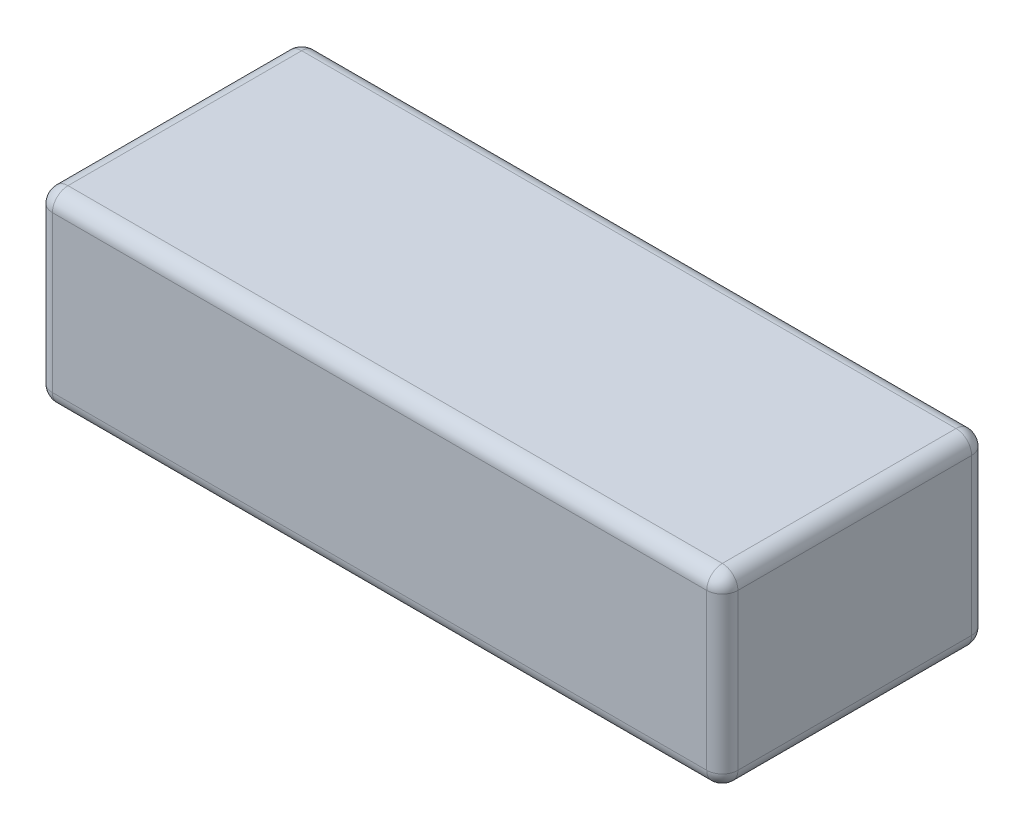
ISO-10303-21;
HEADER;
FILE_DESCRIPTION(('STEP AP214'),'2;1');
FILE_NAME('part.step','',(''),(''),'','','');
FILE_SCHEMA(('AUTOMOTIVE_DESIGN { 1 0 10303 214 1 1 1 1 }'));
ENDSEC;
DATA;
#1=APPLICATION_CONTEXT('core data for automotive mechanical design processes');
#2=APPLICATION_PROTOCOL_DEFINITION('international standard','automotive_design',2000,#1);
#3=PRODUCT_CONTEXT('',#1,'mechanical');
#4=PRODUCT('Part','Part','',(#3));
#5=PRODUCT_RELATED_PRODUCT_CATEGORY('part','',(#4));
#6=PRODUCT_DEFINITION_FORMATION('','',#4);
#7=PRODUCT_DEFINITION_CONTEXT('part definition',#1,'design');
#8=PRODUCT_DEFINITION('design','',#6,#7);
#9=PRODUCT_DEFINITION_SHAPE('','',#8);
#10=(LENGTH_UNIT() NAMED_UNIT(*) SI_UNIT(.MILLI.,.METRE.));
#11=(NAMED_UNIT(*) PLANE_ANGLE_UNIT() SI_UNIT($,.RADIAN.));
#12=(NAMED_UNIT(*) SI_UNIT($,.STERADIAN.) SOLID_ANGLE_UNIT());
#13=UNCERTAINTY_MEASURE_WITH_UNIT(LENGTH_MEASURE(1.E-05),#10,'distance_accuracy_value','');
#14=(GEOMETRIC_REPRESENTATION_CONTEXT(3) GLOBAL_UNCERTAINTY_ASSIGNED_CONTEXT((#13)) GLOBAL_UNIT_ASSIGNED_CONTEXT((#10,
#11,#12)) REPRESENTATION_CONTEXT('',''));
#15=CARTESIAN_POINT('',(0.,0.,0.));
#16=DIRECTION('',(0.,0.,1.));
#17=DIRECTION('',(1.,0.,0.));
#18=AXIS2_PLACEMENT_3D('',#15,#16,#17);
#19=CARTESIAN_POINT('',(0.,0.,0.));
#20=DIRECTION('',(0.,1.,0.));
#21=DIRECTION('',(0.,0.,1.));
#22=AXIS2_PLACEMENT_3D('',#19,#20,#21);
#23=PLANE('',#22);
#24=DIRECTION('',(0.,0.,1.));
#25=VECTOR('',#24,1.);
#26=CARTESIAN_POINT('',(-21.,0.,0.));
#27=LINE('',#26,#25);
#28=CARTESIAN_POINT('',(-21.,0.,7.5));
#29=VERTEX_POINT('',#28);
#30=CARTESIAN_POINT('',(-21.,0.,-7.5));
#31=VERTEX_POINT('',#30);
#32=EDGE_CURVE('E193',#29,#31,#27,.F.);
#33=ORIENTED_EDGE('',*,*,#32,.T.);
#34=DIRECTION('',(-1.,0.,0.));
#35=VECTOR('',#34,1.);
#36=CARTESIAN_POINT('',(0.,0.,-7.5));
#37=LINE('',#36,#35);
#38=CARTESIAN_POINT('',(21.,0.,-7.5));
#39=VERTEX_POINT('',#38);
#40=EDGE_CURVE('E195',#31,#39,#37,.F.);
#41=ORIENTED_EDGE('',*,*,#40,.T.);
#42=DIRECTION('',(0.,0.,-1.));
#43=VECTOR('',#42,1.);
#44=CARTESIAN_POINT('',(21.,0.,0.));
#45=LINE('',#44,#43);
#46=CARTESIAN_POINT('',(21.,0.,7.5));
#47=VERTEX_POINT('',#46);
#48=EDGE_CURVE('E191',#39,#47,#45,.F.);
#49=ORIENTED_EDGE('',*,*,#48,.T.);
#50=DIRECTION('',(1.,0.,0.));
#51=VECTOR('',#50,1.);
#52=CARTESIAN_POINT('',(0.,0.,7.5));
#53=LINE('',#52,#51);
#54=EDGE_CURVE('E189',#47,#29,#53,.F.);
#55=ORIENTED_EDGE('',*,*,#54,.T.);
#56=EDGE_LOOP('',(#33,#41,#49,#55));
#57=FACE_BOUND('',#56,.T.);
#58=DIRECTION('',(0.,0.,-1.));
#59=VECTOR('',#58,1.);
#60=CARTESIAN_POINT('',(-20.,0.,-6.5));
#61=LINE('',#60,#59);
#62=CARTESIAN_POINT('',(-20.,0.,6.5));
#63=VERTEX_POINT('',#62);
#64=CARTESIAN_POINT('',(-20.,0.,-6.5));
#65=VERTEX_POINT('',#64);
#66=EDGE_CURVE('E171',#63,#65,#61,.T.);
#67=ORIENTED_EDGE('',*,*,#66,.F.);
#68=DIRECTION('',(-1.,0.,0.));
#69=VECTOR('',#68,1.);
#70=CARTESIAN_POINT('',(20.,0.,6.5));
#71=LINE('',#70,#69);
#72=CARTESIAN_POINT('',(20.,0.,6.5));
#73=VERTEX_POINT('',#72);
#74=EDGE_CURVE('E168',#73,#63,#71,.T.);
#75=ORIENTED_EDGE('',*,*,#74,.F.);
#76=DIRECTION('',(0.,0.,1.));
#77=VECTOR('',#76,1.);
#78=CARTESIAN_POINT('',(20.,0.,-6.5));
#79=LINE('',#78,#77);
#80=CARTESIAN_POINT('',(20.,0.,-6.5));
#81=VERTEX_POINT('',#80);
#82=EDGE_CURVE('E58',#81,#73,#79,.T.);
#83=ORIENTED_EDGE('',*,*,#82,.F.);
#84=DIRECTION('',(1.,0.,0.));
#85=VECTOR('',#84,1.);
#86=CARTESIAN_POINT('',(20.,0.,-6.5));
#87=LINE('',#86,#85);
#88=EDGE_CURVE('E53',#65,#81,#87,.T.);
#89=ORIENTED_EDGE('',*,*,#88,.F.);
#90=EDGE_LOOP('',(#67,#75,#83,#89));
#91=FACE_BOUND('',#90,.T.);
#92=ADVANCED_FACE('F36',(#57,#91),#23,.F.);
#93=CARTESIAN_POINT('',(22.,12.,-8.5));
#94=DIRECTION('',(-1.,0.,0.));
#95=DIRECTION('',(0.,0.,1.));
#96=AXIS2_PLACEMENT_3D('',#93,#94,#95);
#97=PLANE('',#96);
#98=DIRECTION('',(0.,0.,-1.));
#99=VECTOR('',#98,1.);
#100=CARTESIAN_POINT('',(22.,11.,8.5));
#101=LINE('',#100,#99);
#102=CARTESIAN_POINT('',(22.,11.,-7.5));
#103=VERTEX_POINT('',#102);
#104=CARTESIAN_POINT('',(22.,11.,7.5));
#105=VERTEX_POINT('',#104);
#106=EDGE_CURVE('E209',#103,#105,#101,.F.);
#107=ORIENTED_EDGE('',*,*,#106,.T.);
#108=DIRECTION('',(0.,-1.,0.));
#109=VECTOR('',#108,1.);
#110=CARTESIAN_POINT('',(22.,12.,7.5));
#111=LINE('',#110,#109);
#112=CARTESIAN_POINT('',(22.,1.,7.5));
#113=VERTEX_POINT('',#112);
#114=EDGE_CURVE('E214',#105,#113,#111,.T.);
#115=ORIENTED_EDGE('',*,*,#114,.T.);
#116=DIRECTION('',(0.,0.,-1.));
#117=VECTOR('',#116,1.);
#118=CARTESIAN_POINT('',(22.,1.,-8.5));
#119=LINE('',#118,#117);
#120=CARTESIAN_POINT('',(22.,1.,-7.5));
#121=VERTEX_POINT('',#120);
#122=EDGE_CURVE('E211',#113,#121,#119,.T.);
#123=ORIENTED_EDGE('',*,*,#122,.T.);
#124=DIRECTION('',(0.,-1.,0.));
#125=VECTOR('',#124,1.);
#126=CARTESIAN_POINT('',(22.,12.,-7.5));
#127=LINE('',#126,#125);
#128=EDGE_CURVE('E207',#121,#103,#127,.F.);
#129=ORIENTED_EDGE('',*,*,#128,.T.);
#130=EDGE_LOOP('',(#107,#115,#123,#129));
#131=FACE_BOUND('',#130,.T.);
#132=ADVANCED_FACE('F309',(#131),#97,.F.);
#133=CARTESIAN_POINT('',(-22.,12.,-8.5));
#134=DIRECTION('',(0.,0.,1.));
#135=DIRECTION('',(1.,0.,0.));
#136=AXIS2_PLACEMENT_3D('',#133,#134,#135);
#137=PLANE('',#136);
#138=DIRECTION('',(0.,-1.,0.));
#139=VECTOR('',#138,1.);
#140=CARTESIAN_POINT('',(21.,12.,-8.5));
#141=LINE('',#140,#139);
#142=CARTESIAN_POINT('',(21.,11.,-8.5));
#143=VERTEX_POINT('',#142);
#144=CARTESIAN_POINT('',(21.,1.,-8.5));
#145=VERTEX_POINT('',#144);
#146=EDGE_CURVE('E180',#143,#145,#141,.T.);
#147=ORIENTED_EDGE('',*,*,#146,.T.);
#148=DIRECTION('',(-1.,0.,0.));
#149=VECTOR('',#148,1.);
#150=CARTESIAN_POINT('',(-22.,1.,-8.5));
#151=LINE('',#150,#149);
#152=CARTESIAN_POINT('',(-21.,1.,-8.5));
#153=VERTEX_POINT('',#152);
#154=EDGE_CURVE('E186',#145,#153,#151,.T.);
#155=ORIENTED_EDGE('',*,*,#154,.T.);
#156=DIRECTION('',(0.,-1.,0.));
#157=VECTOR('',#156,1.);
#158=CARTESIAN_POINT('',(-21.,12.,-8.5));
#159=LINE('',#158,#157);
#160=CARTESIAN_POINT('',(-21.,11.,-8.5));
#161=VERTEX_POINT('',#160);
#162=EDGE_CURVE('E184',#153,#161,#159,.F.);
#163=ORIENTED_EDGE('',*,*,#162,.T.);
#164=DIRECTION('',(-1.,0.,0.));
#165=VECTOR('',#164,1.);
#166=CARTESIAN_POINT('',(22.,11.,-8.5));
#167=LINE('',#166,#165);
#168=EDGE_CURVE('E182',#161,#143,#167,.F.);
#169=ORIENTED_EDGE('',*,*,#168,.T.);
#170=EDGE_LOOP('',(#147,#155,#163,#169));
#171=FACE_BOUND('',#170,.T.);
#172=ADVANCED_FACE('F385',(#171),#137,.F.);
#173=CARTESIAN_POINT('',(-22.,12.,-8.5));
#174=DIRECTION('',(1.,0.,0.));
#175=DIRECTION('',(0.,0.,-1.));
#176=AXIS2_PLACEMENT_3D('',#173,#174,#175);
#177=PLANE('',#176);
#178=DIRECTION('',(0.,0.,1.));
#179=VECTOR('',#178,1.);
#180=CARTESIAN_POINT('',(-22.,11.,-8.5));
#181=LINE('',#180,#179);
#182=CARTESIAN_POINT('',(-22.,11.,7.5));
#183=VERTEX_POINT('',#182);
#184=CARTESIAN_POINT('',(-22.,11.,-7.5));
#185=VERTEX_POINT('',#184);
#186=EDGE_CURVE('E200',#183,#185,#181,.F.);
#187=ORIENTED_EDGE('',*,*,#186,.T.);
#188=DIRECTION('',(0.,-1.,0.));
#189=VECTOR('',#188,1.);
#190=CARTESIAN_POINT('',(-22.,12.,-7.5));
#191=LINE('',#190,#189);
#192=CARTESIAN_POINT('',(-22.,1.,-7.5));
#193=VERTEX_POINT('',#192);
#194=EDGE_CURVE('E204',#185,#193,#191,.T.);
#195=ORIENTED_EDGE('',*,*,#194,.T.);
#196=DIRECTION('',(0.,0.,1.));
#197=VECTOR('',#196,1.);
#198=CARTESIAN_POINT('',(-22.,1.,-8.5));
#199=LINE('',#198,#197);
#200=CARTESIAN_POINT('',(-22.,1.,7.5));
#201=VERTEX_POINT('',#200);
#202=EDGE_CURVE('E202',#193,#201,#199,.T.);
#203=ORIENTED_EDGE('',*,*,#202,.T.);
#204=DIRECTION('',(0.,-1.,0.));
#205=VECTOR('',#204,1.);
#206=CARTESIAN_POINT('',(-22.,12.,7.5));
#207=LINE('',#206,#205);
#208=EDGE_CURVE('E198',#201,#183,#207,.F.);
#209=ORIENTED_EDGE('',*,*,#208,.T.);
#210=EDGE_LOOP('',(#187,#195,#203,#209));
#211=FACE_BOUND('',#210,.T.);
#212=ADVANCED_FACE('F364',(#211),#177,.F.);
#213=CARTESIAN_POINT('',(-22.,12.,8.5));
#214=DIRECTION('',(0.,0.,-1.));
#215=DIRECTION('',(-1.,0.,0.));
#216=AXIS2_PLACEMENT_3D('',#213,#214,#215);
#217=PLANE('',#216);
#218=DIRECTION('',(1.,0.,0.));
#219=VECTOR('',#218,1.);
#220=CARTESIAN_POINT('',(-22.,1.,8.5));
#221=LINE('',#220,#219);
#222=CARTESIAN_POINT('',(-21.,1.,8.5));
#223=VERTEX_POINT('',#222);
#224=CARTESIAN_POINT('',(21.,1.,8.5));
#225=VERTEX_POINT('',#224);
#226=EDGE_CURVE('E220',#223,#225,#221,.T.);
#227=ORIENTED_EDGE('',*,*,#226,.T.);
#228=DIRECTION('',(0.,-1.,0.));
#229=VECTOR('',#228,1.);
#230=CARTESIAN_POINT('',(21.,12.,8.5));
#231=LINE('',#230,#229);
#232=CARTESIAN_POINT('',(21.,11.,8.5));
#233=VERTEX_POINT('',#232);
#234=EDGE_CURVE('E223',#225,#233,#231,.F.);
#235=ORIENTED_EDGE('',*,*,#234,.T.);
#236=DIRECTION('',(1.,0.,0.));
#237=VECTOR('',#236,1.);
#238=CARTESIAN_POINT('',(-22.,11.,8.5));
#239=LINE('',#238,#237);
#240=CARTESIAN_POINT('',(-21.,11.,8.5));
#241=VERTEX_POINT('',#240);
#242=EDGE_CURVE('E218',#233,#241,#239,.F.);
#243=ORIENTED_EDGE('',*,*,#242,.T.);
#244=DIRECTION('',(0.,-1.,0.));
#245=VECTOR('',#244,1.);
#246=CARTESIAN_POINT('',(-21.,12.,8.5));
#247=LINE('',#246,#245);
#248=EDGE_CURVE('E216',#241,#223,#247,.T.);
#249=ORIENTED_EDGE('',*,*,#248,.T.);
#250=EDGE_LOOP('',(#227,#235,#243,#249));
#251=FACE_BOUND('',#250,.T.);
#252=ADVANCED_FACE('F329',(#251),#217,.F.);
#253=CARTESIAN_POINT('',(0.,12.,0.));
#254=DIRECTION('',(0.,1.,0.));
#255=DIRECTION('',(0.,0.,1.));
#256=AXIS2_PLACEMENT_3D('',#253,#254,#255);
#257=PLANE('',#256);
#258=DIRECTION('',(1.,0.,0.));
#259=VECTOR('',#258,1.);
#260=CARTESIAN_POINT('',(22.,12.,7.5));
#261=LINE('',#260,#259);
#262=CARTESIAN_POINT('',(-21.,12.,7.5));
#263=VERTEX_POINT('',#262);
#264=CARTESIAN_POINT('',(21.,12.,7.5));
#265=VERTEX_POINT('',#264);
#266=EDGE_CURVE('E225',#263,#265,#261,.T.);
#267=ORIENTED_EDGE('',*,*,#266,.T.);
#268=DIRECTION('',(0.,0.,-1.));
#269=VECTOR('',#268,1.);
#270=CARTESIAN_POINT('',(21.,12.,-8.5));
#271=LINE('',#270,#269);
#272=CARTESIAN_POINT('',(21.,12.,-7.5));
#273=VERTEX_POINT('',#272);
#274=EDGE_CURVE('E12',#265,#273,#271,.T.);
#275=ORIENTED_EDGE('',*,*,#274,.T.);
#276=DIRECTION('',(-1.,0.,0.));
#277=VECTOR('',#276,1.);
#278=CARTESIAN_POINT('',(-22.,12.,-7.5));
#279=LINE('',#278,#277);
#280=CARTESIAN_POINT('',(-21.,12.,-7.5));
#281=VERTEX_POINT('',#280);
#282=EDGE_CURVE('E45',#273,#281,#279,.T.);
#283=ORIENTED_EDGE('',*,*,#282,.T.);
#284=DIRECTION('',(0.,0.,1.));
#285=VECTOR('',#284,1.);
#286=CARTESIAN_POINT('',(-21.,12.,8.5));
#287=LINE('',#286,#285);
#288=EDGE_CURVE('E227',#281,#263,#287,.T.);
#289=ORIENTED_EDGE('',*,*,#288,.T.);
#290=EDGE_LOOP('',(#267,#275,#283,#289));
#291=FACE_BOUND('',#290,.T.);
#292=ADVANCED_FACE('F318',(#291),#257,.T.);
#293=CARTESIAN_POINT('',(0.,11.,7.5));
#294=DIRECTION('',(-1.,0.,0.));
#295=DIRECTION('',(0.,0.,1.));
#296=AXIS2_PLACEMENT_3D('',#293,#294,#295);
#297=CYLINDRICAL_SURFACE('',#296,1.);
#298=CARTESIAN_POINT('',(21.,11.,7.5));
#299=DIRECTION('',(1.,0.,0.));
#300=DIRECTION('',(0.,0.,-1.));
#301=AXIS2_PLACEMENT_3D('',#298,#299,#300);
#302=CIRCLE('',#301,1.);
#303=EDGE_CURVE('E40',#265,#233,#302,.T.);
#304=ORIENTED_EDGE('',*,*,#303,.F.);
#305=ORIENTED_EDGE('',*,*,#266,.F.);
#306=CARTESIAN_POINT('',(-21.,11.,7.5));
#307=DIRECTION('',(-1.,0.,0.));
#308=DIRECTION('',(0.,0.,1.));
#309=AXIS2_PLACEMENT_3D('',#306,#307,#308);
#310=CIRCLE('',#309,1.);
#311=EDGE_CURVE('E286',#241,#263,#310,.T.);
#312=ORIENTED_EDGE('',*,*,#311,.F.);
#313=ORIENTED_EDGE('',*,*,#242,.F.);
#314=EDGE_LOOP('',(#304,#305,#312,#313));
#315=FACE_BOUND('',#314,.T.);
#316=ADVANCED_FACE('F38',(#315),#297,.T.);
#317=CARTESIAN_POINT('',(21.,11.,7.5));
#318=DIRECTION('',(0.,0.,1.));
#319=DIRECTION('',(1.,0.,0.));
#320=AXIS2_PLACEMENT_3D('',#317,#318,#319);
#321=SPHERICAL_SURFACE('',#320,1.);
#322=CARTESIAN_POINT('',(21.,11.,7.5));
#323=DIRECTION('',(0.,0.,1.));
#324=DIRECTION('',(0.,-1.,0.));
#325=AXIS2_PLACEMENT_3D('',#322,#323,#324);
#326=CIRCLE('',#325,1.);
#327=EDGE_CURVE('E281',#265,#105,#326,.F.);
#328=ORIENTED_EDGE('',*,*,#327,.F.);
#329=ORIENTED_EDGE('',*,*,#303,.T.);
#330=CARTESIAN_POINT('',(21.,11.,7.5));
#331=DIRECTION('',(0.,1.,0.));
#332=DIRECTION('',(0.,0.,1.));
#333=AXIS2_PLACEMENT_3D('',#330,#331,#332);
#334=CIRCLE('',#333,1.);
#335=EDGE_CURVE('E284',#105,#233,#334,.F.);
#336=ORIENTED_EDGE('',*,*,#335,.F.);
#337=EDGE_LOOP('',(#328,#329,#336));
#338=FACE_BOUND('',#337,.T.);
#339=ADVANCED_FACE('F297',(#338),#321,.T.);
#340=CARTESIAN_POINT('',(-21.,11.,7.5));
#341=DIRECTION('',(0.,0.,1.));
#342=DIRECTION('',(1.,0.,0.));
#343=AXIS2_PLACEMENT_3D('',#340,#341,#342);
#344=SPHERICAL_SURFACE('',#343,1.);
#345=CARTESIAN_POINT('',(-21.,11.,7.5));
#346=DIRECTION('',(0.,1.,0.));
#347=DIRECTION('',(0.,0.,1.));
#348=AXIS2_PLACEMENT_3D('',#345,#346,#347);
#349=CIRCLE('',#348,1.);
#350=EDGE_CURVE('E275',#241,#183,#349,.F.);
#351=ORIENTED_EDGE('',*,*,#350,.F.);
#352=ORIENTED_EDGE('',*,*,#311,.T.);
#353=CARTESIAN_POINT('',(-21.,11.,7.5));
#354=DIRECTION('',(0.,0.,1.));
#355=DIRECTION('',(1.,0.,0.));
#356=AXIS2_PLACEMENT_3D('',#353,#354,#355);
#357=CIRCLE('',#356,1.);
#358=EDGE_CURVE('E278',#183,#263,#357,.F.);
#359=ORIENTED_EDGE('',*,*,#358,.F.);
#360=EDGE_LOOP('',(#351,#352,#359));
#361=FACE_BOUND('',#360,.T.);
#362=ADVANCED_FACE('F321',(#361),#344,.T.);
#363=CARTESIAN_POINT('',(21.,12.,7.5));
#364=DIRECTION('',(0.,-1.,0.));
#365=DIRECTION('',(0.,0.,-1.));
#366=AXIS2_PLACEMENT_3D('',#363,#364,#365);
#367=CYLINDRICAL_SURFACE('',#366,1.);
#368=ORIENTED_EDGE('',*,*,#335,.T.);
#369=ORIENTED_EDGE('',*,*,#234,.F.);
#370=CARTESIAN_POINT('',(21.,1.,7.5));
#371=DIRECTION('',(0.,-1.,0.));
#372=DIRECTION('',(0.,0.,-1.));
#373=AXIS2_PLACEMENT_3D('',#370,#371,#372);
#374=CIRCLE('',#373,1.);
#375=EDGE_CURVE('E270',#113,#225,#374,.T.);
#376=ORIENTED_EDGE('',*,*,#375,.F.);
#377=ORIENTED_EDGE('',*,*,#114,.F.);
#378=EDGE_LOOP('',(#368,#369,#376,#377));
#379=FACE_BOUND('',#378,.T.);
#380=ADVANCED_FACE('F305',(#379),#367,.T.);
#381=CARTESIAN_POINT('',(21.,11.,0.));
#382=DIRECTION('',(0.,0.,1.));
#383=DIRECTION('',(1.,0.,0.));
#384=AXIS2_PLACEMENT_3D('',#381,#382,#383);
#385=CYLINDRICAL_SURFACE('',#384,1.);
#386=ORIENTED_EDGE('',*,*,#327,.T.);
#387=ORIENTED_EDGE('',*,*,#106,.F.);
#388=CARTESIAN_POINT('',(21.,11.,-7.5));
#389=DIRECTION('',(0.,0.,-1.));
#390=DIRECTION('',(-1.,0.,0.));
#391=AXIS2_PLACEMENT_3D('',#388,#389,#390);
#392=CIRCLE('',#391,1.);
#393=EDGE_CURVE('E267',#273,#103,#392,.T.);
#394=ORIENTED_EDGE('',*,*,#393,.F.);
#395=ORIENTED_EDGE('',*,*,#274,.F.);
#396=EDGE_LOOP('',(#386,#387,#394,#395));
#397=FACE_BOUND('',#396,.T.);
#398=ADVANCED_FACE('F315',(#397),#385,.T.);
#399=CARTESIAN_POINT('',(0.,11.,-7.5));
#400=DIRECTION('',(1.,0.,0.));
#401=DIRECTION('',(0.,0.,-1.));
#402=AXIS2_PLACEMENT_3D('',#399,#400,#401);
#403=CYLINDRICAL_SURFACE('',#402,1.);
#404=CARTESIAN_POINT('',(-21.,11.,-7.5));
#405=DIRECTION('',(-1.,0.,0.));
#406=DIRECTION('',(0.,0.,1.));
#407=AXIS2_PLACEMENT_3D('',#404,#405,#406);
#408=CIRCLE('',#407,1.);
#409=EDGE_CURVE('E262',#281,#161,#408,.T.);
#410=ORIENTED_EDGE('',*,*,#409,.F.);
#411=ORIENTED_EDGE('',*,*,#282,.F.);
#412=CARTESIAN_POINT('',(21.,11.,-7.5));
#413=DIRECTION('',(1.,0.,0.));
#414=DIRECTION('',(0.,0.,-1.));
#415=AXIS2_PLACEMENT_3D('',#412,#413,#414);
#416=CIRCLE('',#415,1.);
#417=EDGE_CURVE('E265',#143,#273,#416,.T.);
#418=ORIENTED_EDGE('',*,*,#417,.F.);
#419=ORIENTED_EDGE('',*,*,#168,.F.);
#420=EDGE_LOOP('',(#410,#411,#418,#419));
#421=FACE_BOUND('',#420,.T.);
#422=ADVANCED_FACE('F355',(#421),#403,.T.);
#423=CARTESIAN_POINT('',(-21.,11.,0.));
#424=DIRECTION('',(0.,0.,-1.));
#425=DIRECTION('',(-1.,0.,0.));
#426=AXIS2_PLACEMENT_3D('',#423,#424,#425);
#427=CYLINDRICAL_SURFACE('',#426,1.);
#428=ORIENTED_EDGE('',*,*,#358,.T.);
#429=ORIENTED_EDGE('',*,*,#288,.F.);
#430=CARTESIAN_POINT('',(-21.,11.,-7.5));
#431=DIRECTION('',(0.,0.,-1.));
#432=DIRECTION('',(-1.,0.,0.));
#433=AXIS2_PLACEMENT_3D('',#430,#431,#432);
#434=CIRCLE('',#433,1.);
#435=EDGE_CURVE('E259',#185,#281,#434,.T.);
#436=ORIENTED_EDGE('',*,*,#435,.F.);
#437=ORIENTED_EDGE('',*,*,#186,.F.);
#438=EDGE_LOOP('',(#428,#429,#436,#437));
#439=FACE_BOUND('',#438,.T.);
#440=ADVANCED_FACE('F362',(#439),#427,.T.);
#441=CARTESIAN_POINT('',(-21.,12.,7.5));
#442=DIRECTION('',(0.,-1.,0.));
#443=DIRECTION('',(0.,0.,-1.));
#444=AXIS2_PLACEMENT_3D('',#441,#442,#443);
#445=CYLINDRICAL_SURFACE('',#444,1.);
#446=ORIENTED_EDGE('',*,*,#350,.T.);
#447=ORIENTED_EDGE('',*,*,#208,.F.);
#448=CARTESIAN_POINT('',(-21.,1.,7.5));
#449=DIRECTION('',(0.,-1.,0.));
#450=DIRECTION('',(0.,0.,-1.));
#451=AXIS2_PLACEMENT_3D('',#448,#449,#450);
#452=CIRCLE('',#451,1.);
#453=EDGE_CURVE('E256',#223,#201,#452,.T.);
#454=ORIENTED_EDGE('',*,*,#453,.F.);
#455=ORIENTED_EDGE('',*,*,#248,.F.);
#456=EDGE_LOOP('',(#446,#447,#454,#455));
#457=FACE_BOUND('',#456,.T.);
#458=ADVANCED_FACE('F326',(#457),#445,.T.);
#459=CARTESIAN_POINT('',(-22.,1.,7.5));
#460=DIRECTION('',(1.,0.,0.));
#461=DIRECTION('',(0.,0.,-1.));
#462=AXIS2_PLACEMENT_3D('',#459,#460,#461);
#463=CYLINDRICAL_SURFACE('',#462,1.);
#464=CARTESIAN_POINT('',(21.,1.,7.5));
#465=DIRECTION('',(1.,0.,0.));
#466=DIRECTION('',(0.,0.,-1.));
#467=AXIS2_PLACEMENT_3D('',#464,#465,#466);
#468=CIRCLE('',#467,1.);
#469=EDGE_CURVE('E272',#225,#47,#468,.T.);
#470=ORIENTED_EDGE('',*,*,#469,.F.);
#471=ORIENTED_EDGE('',*,*,#226,.F.);
#472=CARTESIAN_POINT('',(-21.,1.,7.5));
#473=DIRECTION('',(-1.,0.,0.));
#474=DIRECTION('',(0.,0.,1.));
#475=AXIS2_PLACEMENT_3D('',#472,#473,#474);
#476=CIRCLE('',#475,1.);
#477=EDGE_CURVE('E253',#29,#223,#476,.T.);
#478=ORIENTED_EDGE('',*,*,#477,.F.);
#479=ORIENTED_EDGE('',*,*,#54,.F.);
#480=EDGE_LOOP('',(#470,#471,#478,#479));
#481=FACE_BOUND('',#480,.T.);
#482=ADVANCED_FACE('F333',(#481),#463,.T.);
#483=CARTESIAN_POINT('',(21.,1.,7.5));
#484=DIRECTION('',(0.,0.,1.));
#485=DIRECTION('',(1.,0.,0.));
#486=AXIS2_PLACEMENT_3D('',#483,#484,#485);
#487=SPHERICAL_SURFACE('',#486,1.);
#488=ORIENTED_EDGE('',*,*,#375,.T.);
#489=ORIENTED_EDGE('',*,*,#469,.T.);
#490=CARTESIAN_POINT('',(21.,1.,7.5));
#491=DIRECTION('',(0.,0.,1.));
#492=DIRECTION('',(1.,0.,0.));
#493=AXIS2_PLACEMENT_3D('',#490,#491,#492);
#494=CIRCLE('',#493,1.);
#495=EDGE_CURVE('E250',#113,#47,#494,.F.);
#496=ORIENTED_EDGE('',*,*,#495,.F.);
#497=EDGE_LOOP('',(#488,#489,#496));
#498=FACE_BOUND('',#497,.T.);
#499=ADVANCED_FACE('F337',(#498),#487,.T.);
#500=CARTESIAN_POINT('',(21.,11.,-7.5));
#501=DIRECTION('',(0.,0.,1.));
#502=DIRECTION('',(1.,0.,0.));
#503=AXIS2_PLACEMENT_3D('',#500,#501,#502);
#504=SPHERICAL_SURFACE('',#503,1.);
#505=ORIENTED_EDGE('',*,*,#417,.T.);
#506=ORIENTED_EDGE('',*,*,#393,.T.);
#507=CARTESIAN_POINT('',(21.,11.,-7.5));
#508=DIRECTION('',(0.,1.,0.));
#509=DIRECTION('',(0.,0.,1.));
#510=AXIS2_PLACEMENT_3D('',#507,#508,#509);
#511=CIRCLE('',#510,1.);
#512=EDGE_CURVE('E247',#143,#103,#511,.F.);
#513=ORIENTED_EDGE('',*,*,#512,.F.);
#514=EDGE_LOOP('',(#505,#506,#513));
#515=FACE_BOUND('',#514,.T.);
#516=ADVANCED_FACE('F350',(#515),#504,.T.);
#517=CARTESIAN_POINT('',(-21.,11.,-7.5));
#518=DIRECTION('',(0.,0.,1.));
#519=DIRECTION('',(1.,0.,0.));
#520=AXIS2_PLACEMENT_3D('',#517,#518,#519);
#521=SPHERICAL_SURFACE('',#520,1.);
#522=ORIENTED_EDGE('',*,*,#435,.T.);
#523=ORIENTED_EDGE('',*,*,#409,.T.);
#524=CARTESIAN_POINT('',(-21.,11.,-7.5));
#525=DIRECTION('',(0.,1.,0.));
#526=DIRECTION('',(0.,0.,1.));
#527=AXIS2_PLACEMENT_3D('',#524,#525,#526);
#528=CIRCLE('',#527,1.);
#529=EDGE_CURVE('E244',#185,#161,#528,.F.);
#530=ORIENTED_EDGE('',*,*,#529,.F.);
#531=EDGE_LOOP('',(#522,#523,#530));
#532=FACE_BOUND('',#531,.T.);
#533=ADVANCED_FACE('F359',(#532),#521,.T.);
#534=CARTESIAN_POINT('',(-21.,1.,7.5));
#535=DIRECTION('',(0.,0.,1.));
#536=DIRECTION('',(1.,0.,0.));
#537=AXIS2_PLACEMENT_3D('',#534,#535,#536);
#538=SPHERICAL_SURFACE('',#537,1.);
#539=ORIENTED_EDGE('',*,*,#477,.T.);
#540=ORIENTED_EDGE('',*,*,#453,.T.);
#541=CARTESIAN_POINT('',(-21.,1.,7.5));
#542=DIRECTION('',(0.,0.,1.));
#543=DIRECTION('',(1.,0.,0.));
#544=AXIS2_PLACEMENT_3D('',#541,#542,#543);
#545=CIRCLE('',#544,1.);
#546=EDGE_CURVE('E241',#29,#201,#545,.F.);
#547=ORIENTED_EDGE('',*,*,#546,.F.);
#548=EDGE_LOOP('',(#539,#540,#547));
#549=FACE_BOUND('',#548,.T.);
#550=ADVANCED_FACE('F367',(#549),#538,.T.);
#551=CARTESIAN_POINT('',(21.,1.,-8.5));
#552=DIRECTION('',(0.,0.,-1.));
#553=DIRECTION('',(-1.,0.,0.));
#554=AXIS2_PLACEMENT_3D('',#551,#552,#553);
#555=CYLINDRICAL_SURFACE('',#554,1.);
#556=ORIENTED_EDGE('',*,*,#495,.T.);
#557=ORIENTED_EDGE('',*,*,#48,.F.);
#558=CARTESIAN_POINT('',(21.,1.,-7.5));
#559=DIRECTION('',(0.,0.,-1.));
#560=DIRECTION('',(-1.,0.,0.));
#561=AXIS2_PLACEMENT_3D('',#558,#559,#560);
#562=CIRCLE('',#561,1.);
#563=EDGE_CURVE('E238',#121,#39,#562,.T.);
#564=ORIENTED_EDGE('',*,*,#563,.F.);
#565=ORIENTED_EDGE('',*,*,#122,.F.);
#566=EDGE_LOOP('',(#556,#557,#564,#565));
#567=FACE_BOUND('',#566,.T.);
#568=ADVANCED_FACE('F340',(#567),#555,.T.);
#569=CARTESIAN_POINT('',(21.,12.,-7.5));
#570=DIRECTION('',(0.,-1.,0.));
#571=DIRECTION('',(0.,0.,-1.));
#572=AXIS2_PLACEMENT_3D('',#569,#570,#571);
#573=CYLINDRICAL_SURFACE('',#572,1.);
#574=ORIENTED_EDGE('',*,*,#512,.T.);
#575=ORIENTED_EDGE('',*,*,#128,.F.);
#576=CARTESIAN_POINT('',(21.,1.,-7.5));
#577=DIRECTION('',(0.,-1.,0.));
#578=DIRECTION('',(0.,0.,-1.));
#579=AXIS2_PLACEMENT_3D('',#576,#577,#578);
#580=CIRCLE('',#579,1.);
#581=EDGE_CURVE('E236',#145,#121,#580,.T.);
#582=ORIENTED_EDGE('',*,*,#581,.F.);
#583=ORIENTED_EDGE('',*,*,#146,.F.);
#584=EDGE_LOOP('',(#574,#575,#582,#583));
#585=FACE_BOUND('',#584,.T.);
#586=ADVANCED_FACE('F346',(#585),#573,.T.);
#587=CARTESIAN_POINT('',(-21.,12.,-7.5));
#588=DIRECTION('',(0.,-1.,0.));
#589=DIRECTION('',(0.,0.,-1.));
#590=AXIS2_PLACEMENT_3D('',#587,#588,#589);
#591=CYLINDRICAL_SURFACE('',#590,1.);
#592=ORIENTED_EDGE('',*,*,#529,.T.);
#593=ORIENTED_EDGE('',*,*,#162,.F.);
#594=CARTESIAN_POINT('',(-21.,1.,-7.5));
#595=DIRECTION('',(0.,-1.,0.));
#596=DIRECTION('',(0.,0.,-1.));
#597=AXIS2_PLACEMENT_3D('',#594,#595,#596);
#598=CIRCLE('',#597,1.);
#599=EDGE_CURVE('E233',#193,#153,#598,.T.);
#600=ORIENTED_EDGE('',*,*,#599,.F.);
#601=ORIENTED_EDGE('',*,*,#194,.F.);
#602=EDGE_LOOP('',(#592,#593,#600,#601));
#603=FACE_BOUND('',#602,.T.);
#604=ADVANCED_FACE('F383',(#603),#591,.T.);
#605=CARTESIAN_POINT('',(-21.,1.,-8.5));
#606=DIRECTION('',(0.,0.,1.));
#607=DIRECTION('',(1.,0.,0.));
#608=AXIS2_PLACEMENT_3D('',#605,#606,#607);
#609=CYLINDRICAL_SURFACE('',#608,1.);
#610=ORIENTED_EDGE('',*,*,#546,.T.);
#611=ORIENTED_EDGE('',*,*,#202,.F.);
#612=CARTESIAN_POINT('',(-21.,1.,-7.5));
#613=DIRECTION('',(0.,0.,-1.));
#614=DIRECTION('',(-1.,0.,0.));
#615=AXIS2_PLACEMENT_3D('',#612,#613,#614);
#616=CIRCLE('',#615,1.);
#617=EDGE_CURVE('E231',#31,#193,#616,.T.);
#618=ORIENTED_EDGE('',*,*,#617,.F.);
#619=ORIENTED_EDGE('',*,*,#32,.F.);
#620=EDGE_LOOP('',(#610,#611,#618,#619));
#621=FACE_BOUND('',#620,.T.);
#622=ADVANCED_FACE('F370',(#621),#609,.T.);
#623=CARTESIAN_POINT('',(21.,1.,-7.5));
#624=DIRECTION('',(0.,0.,1.));
#625=DIRECTION('',(1.,0.,0.));
#626=AXIS2_PLACEMENT_3D('',#623,#624,#625);
#627=SPHERICAL_SURFACE('',#626,1.);
#628=ORIENTED_EDGE('',*,*,#581,.T.);
#629=ORIENTED_EDGE('',*,*,#563,.T.);
#630=CARTESIAN_POINT('',(21.,1.,-7.5));
#631=DIRECTION('',(1.,0.,0.));
#632=DIRECTION('',(0.,0.,-1.));
#633=AXIS2_PLACEMENT_3D('',#630,#631,#632);
#634=CIRCLE('',#633,1.);
#635=EDGE_CURVE('E174',#145,#39,#634,.F.);
#636=ORIENTED_EDGE('',*,*,#635,.F.);
#637=EDGE_LOOP('',(#628,#629,#636));
#638=FACE_BOUND('',#637,.T.);
#639=ADVANCED_FACE('F444',(#638),#627,.T.);
#640=CARTESIAN_POINT('',(-21.,1.,-7.5));
#641=DIRECTION('',(0.,0.,1.));
#642=DIRECTION('',(1.,0.,0.));
#643=AXIS2_PLACEMENT_3D('',#640,#641,#642);
#644=SPHERICAL_SURFACE('',#643,1.);
#645=ORIENTED_EDGE('',*,*,#617,.T.);
#646=ORIENTED_EDGE('',*,*,#599,.T.);
#647=CARTESIAN_POINT('',(-21.,1.,-7.5));
#648=DIRECTION('',(-1.,0.,0.));
#649=DIRECTION('',(0.,0.,1.));
#650=AXIS2_PLACEMENT_3D('',#647,#648,#649);
#651=CIRCLE('',#650,1.);
#652=EDGE_CURVE('E172',#31,#153,#651,.F.);
#653=ORIENTED_EDGE('',*,*,#652,.F.);
#654=EDGE_LOOP('',(#645,#646,#653));
#655=FACE_BOUND('',#654,.T.);
#656=ADVANCED_FACE('F379',(#655),#644,.T.);
#657=CARTESIAN_POINT('',(-22.,1.,-7.5));
#658=DIRECTION('',(-1.,0.,0.));
#659=DIRECTION('',(0.,0.,1.));
#660=AXIS2_PLACEMENT_3D('',#657,#658,#659);
#661=CYLINDRICAL_SURFACE('',#660,1.);
#662=ORIENTED_EDGE('',*,*,#635,.T.);
#663=ORIENTED_EDGE('',*,*,#40,.F.);
#664=ORIENTED_EDGE('',*,*,#652,.T.);
#665=ORIENTED_EDGE('',*,*,#154,.F.);
#666=EDGE_LOOP('',(#662,#663,#664,#665));
#667=FACE_BOUND('',#666,.T.);
#668=ADVANCED_FACE('F376',(#667),#661,.T.);
#669=CARTESIAN_POINT('',(-20.,-0.6,-6.5));
#670=DIRECTION('',(1.,0.,0.));
#671=DIRECTION('',(0.,0.,-1.));
#672=AXIS2_PLACEMENT_3D('',#669,#670,#671);
#673=PLANE('',#672);
#674=ORIENTED_EDGE('',*,*,#66,.T.);
#675=DIRECTION('',(0.,1.,0.));
#676=VECTOR('',#675,1.);
#677=CARTESIAN_POINT('',(-20.,-0.6,-6.5));
#678=LINE('',#677,#676);
#679=CARTESIAN_POINT('',(-20.,-0.6,-6.5));
#680=VERTEX_POINT('',#679);
#681=EDGE_CURVE('E152',#680,#65,#678,.T.);
#682=ORIENTED_EDGE('',*,*,#681,.F.);
#683=DIRECTION('',(0.,0.,-1.));
#684=VECTOR('',#683,1.);
#685=CARTESIAN_POINT('',(-20.,-0.6,-6.5));
#686=LINE('',#685,#684);
#687=CARTESIAN_POINT('',(-20.,-0.6,6.5));
#688=VERTEX_POINT('',#687);
#689=EDGE_CURVE('E159',#688,#680,#686,.T.);
#690=ORIENTED_EDGE('',*,*,#689,.F.);
#691=DIRECTION('',(0.,1.,0.));
#692=VECTOR('',#691,1.);
#693=CARTESIAN_POINT('',(-20.,-0.6,6.5));
#694=LINE('',#693,#692);
#695=EDGE_CURVE('E639',#688,#63,#694,.T.);
#696=ORIENTED_EDGE('',*,*,#695,.T.);
#697=EDGE_LOOP('',(#674,#682,#690,#696));
#698=FACE_BOUND('',#697,.T.);
#699=ADVANCED_FACE('F170',(#698),#673,.F.);
#700=CARTESIAN_POINT('',(20.,-0.6,-6.5));
#701=DIRECTION('',(0.,0.,1.));
#702=DIRECTION('',(1.,0.,0.));
#703=AXIS2_PLACEMENT_3D('',#700,#701,#702);
#704=PLANE('',#703);
#705=ORIENTED_EDGE('',*,*,#88,.T.);
#706=DIRECTION('',(0.,1.,0.));
#707=VECTOR('',#706,1.);
#708=CARTESIAN_POINT('',(20.,-0.6,-6.5));
#709=LINE('',#708,#707);
#710=CARTESIAN_POINT('',(20.,-0.6,-6.5));
#711=VERTEX_POINT('',#710);
#712=EDGE_CURVE('E155',#711,#81,#709,.T.);
#713=ORIENTED_EDGE('',*,*,#712,.F.);
#714=DIRECTION('',(1.,0.,0.));
#715=VECTOR('',#714,1.);
#716=CARTESIAN_POINT('',(20.,-0.6,-6.5));
#717=LINE('',#716,#715);
#718=EDGE_CURVE('E148',#680,#711,#717,.T.);
#719=ORIENTED_EDGE('',*,*,#718,.F.);
#720=ORIENTED_EDGE('',*,*,#681,.T.);
#721=EDGE_LOOP('',(#705,#713,#719,#720));
#722=FACE_BOUND('',#721,.T.);
#723=ADVANCED_FACE('F150',(#722),#704,.F.);
#724=CARTESIAN_POINT('',(20.,-0.6,-6.5));
#725=DIRECTION('',(-1.,0.,0.));
#726=DIRECTION('',(0.,0.,1.));
#727=AXIS2_PLACEMENT_3D('',#724,#725,#726);
#728=PLANE('',#727);
#729=ORIENTED_EDGE('',*,*,#82,.T.);
#730=DIRECTION('',(0.,1.,0.));
#731=VECTOR('',#730,1.);
#732=CARTESIAN_POINT('',(20.,-0.6,6.5));
#733=LINE('',#732,#731);
#734=CARTESIAN_POINT('',(20.,-0.6,6.5));
#735=VERTEX_POINT('',#734);
#736=EDGE_CURVE('E176',#735,#73,#733,.T.);
#737=ORIENTED_EDGE('',*,*,#736,.F.);
#738=DIRECTION('',(0.,0.,1.));
#739=VECTOR('',#738,1.);
#740=CARTESIAN_POINT('',(20.,-0.6,-6.5));
#741=LINE('',#740,#739);
#742=EDGE_CURVE('E158',#711,#735,#741,.T.);
#743=ORIENTED_EDGE('',*,*,#742,.F.);
#744=ORIENTED_EDGE('',*,*,#712,.T.);
#745=EDGE_LOOP('',(#729,#737,#743,#744));
#746=FACE_BOUND('',#745,.T.);
#747=ADVANCED_FACE('F456',(#746),#728,.F.);
#748=CARTESIAN_POINT('',(20.,-0.6,6.5));
#749=DIRECTION('',(0.,0.,-1.));
#750=DIRECTION('',(-1.,0.,0.));
#751=AXIS2_PLACEMENT_3D('',#748,#749,#750);
#752=PLANE('',#751);
#753=ORIENTED_EDGE('',*,*,#74,.T.);
#754=ORIENTED_EDGE('',*,*,#695,.F.);
#755=DIRECTION('',(-1.,0.,0.));
#756=VECTOR('',#755,1.);
#757=CARTESIAN_POINT('',(20.,-0.6,6.5));
#758=LINE('',#757,#756);
#759=EDGE_CURVE('E164',#735,#688,#758,.T.);
#760=ORIENTED_EDGE('',*,*,#759,.F.);
#761=ORIENTED_EDGE('',*,*,#736,.T.);
#762=EDGE_LOOP('',(#753,#754,#760,#761));
#763=FACE_BOUND('',#762,.T.);
#764=ADVANCED_FACE('F461',(#763),#752,.F.);
#765=CARTESIAN_POINT('',(0.,-0.6,0.));
#766=DIRECTION('',(0.,-1.,0.));
#767=DIRECTION('',(0.,0.,-1.));
#768=AXIS2_PLACEMENT_3D('',#765,#766,#767);
#769=PLANE('',#768);
#770=ORIENTED_EDGE('',*,*,#689,.T.);
#771=ORIENTED_EDGE('',*,*,#718,.T.);
#772=ORIENTED_EDGE('',*,*,#742,.T.);
#773=ORIENTED_EDGE('',*,*,#759,.T.);
#774=EDGE_LOOP('',(#770,#771,#772,#773));
#775=FACE_BOUND('',#774,.T.);
#776=ADVANCED_FACE('F162',(#775),#769,.T.);
#777=CLOSED_SHELL('',(#92,#132,#172,#212,#252,#292,#316,#339,#362,#380,#398,#422,#440,#458,#482,
#499,#516,#533,#550,#568,#586,#604,#622,#639,#656,#668,#699,#723,#747,#764,#776));
#778=MANIFOLD_SOLID_BREP('B2',#777);
#779=ADVANCED_BREP_SHAPE_REPRESENTATION('',(#18,#778),#14);
#780=SHAPE_DEFINITION_REPRESENTATION(#9,#779);
ENDSEC;
END-ISO-10303-21;
